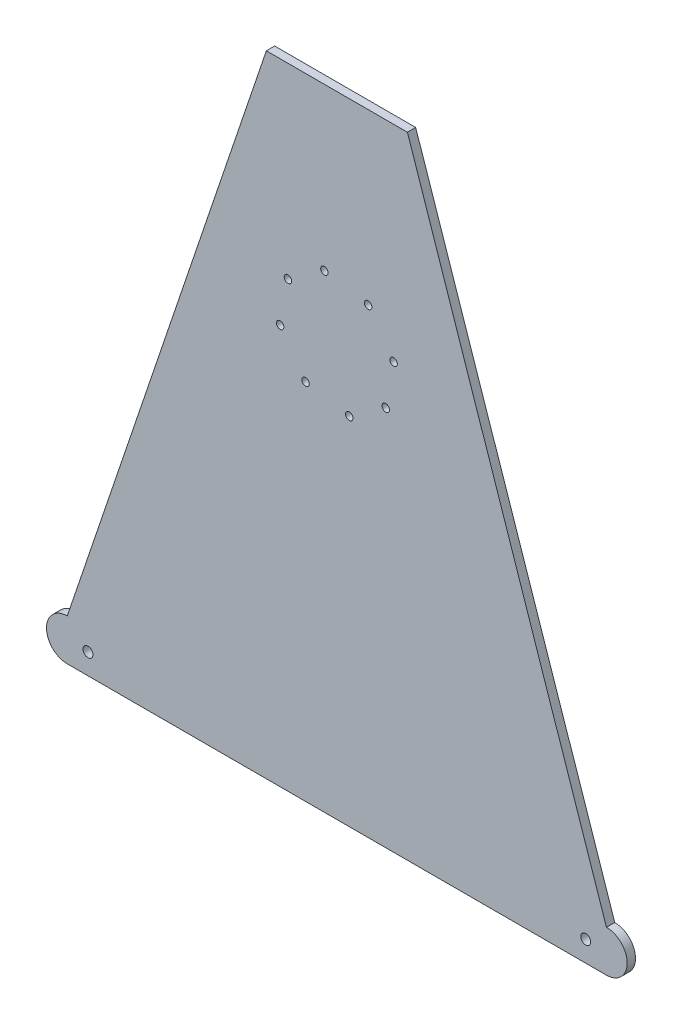
ISO-10303-21;
HEADER;
FILE_DESCRIPTION(('STEP AP214'),'2;1');
FILE_NAME('part.step','',(''),(''),'','','');
FILE_SCHEMA(('AUTOMOTIVE_DESIGN { 1 0 10303 214 1 1 1 1 }'));
ENDSEC;
DATA;
#1=APPLICATION_CONTEXT('core data for automotive mechanical design processes');
#2=APPLICATION_PROTOCOL_DEFINITION('international standard','automotive_design',2000,#1);
#3=PRODUCT_CONTEXT('',#1,'mechanical');
#4=PRODUCT('Part','Part','',(#3));
#5=PRODUCT_RELATED_PRODUCT_CATEGORY('part','',(#4));
#6=PRODUCT_DEFINITION_FORMATION('','',#4);
#7=PRODUCT_DEFINITION_CONTEXT('part definition',#1,'design');
#8=PRODUCT_DEFINITION('design','',#6,#7);
#9=PRODUCT_DEFINITION_SHAPE('','',#8);
#10=(LENGTH_UNIT() NAMED_UNIT(*) SI_UNIT(.MILLI.,.METRE.));
#11=(NAMED_UNIT(*) PLANE_ANGLE_UNIT() SI_UNIT($,.RADIAN.));
#12=(NAMED_UNIT(*) SI_UNIT($,.STERADIAN.) SOLID_ANGLE_UNIT());
#13=UNCERTAINTY_MEASURE_WITH_UNIT(LENGTH_MEASURE(1.E-05),#10,'distance_accuracy_value','');
#14=(GEOMETRIC_REPRESENTATION_CONTEXT(3) GLOBAL_UNCERTAINTY_ASSIGNED_CONTEXT((#13)) GLOBAL_UNIT_ASSIGNED_CONTEXT((#10,
#11,#12)) REPRESENTATION_CONTEXT('',''));
#15=CARTESIAN_POINT('',(0.,0.,0.));
#16=DIRECTION('',(0.,0.,1.));
#17=DIRECTION('',(1.,0.,0.));
#18=AXIS2_PLACEMENT_3D('',#15,#16,#17);
#19=CARTESIAN_POINT('',(325.,0.,-10.));
#20=DIRECTION('',(0.,0.,1.));
#21=DIRECTION('',(-1.,0.,0.));
#22=AXIS2_PLACEMENT_3D('',#19,#20,#21);
#23=CYLINDRICAL_SURFACE('',#22,25.);
#24=DIRECTION('',(0.,0.,1.));
#25=VECTOR('',#24,1.);
#26=CARTESIAN_POINT('',(325.,25.,-10.));
#27=LINE('',#26,#25);
#28=CARTESIAN_POINT('',(325.,25.,-10.));
#29=VERTEX_POINT('',#28);
#30=CARTESIAN_POINT('',(325.,25.,0.));
#31=VERTEX_POINT('',#30);
#32=EDGE_CURVE('E146',#29,#31,#27,.T.);
#33=ORIENTED_EDGE('',*,*,#32,.T.);
#34=CARTESIAN_POINT('',(325.,0.,0.));
#35=DIRECTION('',(0.,0.,-1.));
#36=DIRECTION('',(-1.,0.,0.));
#37=AXIS2_PLACEMENT_3D('',#34,#35,#36);
#38=CIRCLE('',#37,25.);
#39=CARTESIAN_POINT('',(325.,-25.,0.));
#40=VERTEX_POINT('',#39);
#41=EDGE_CURVE('E44',#31,#40,#38,.T.);
#42=ORIENTED_EDGE('',*,*,#41,.T.);
#43=DIRECTION('',(0.,0.,1.));
#44=VECTOR('',#43,1.);
#45=CARTESIAN_POINT('',(325.,-25.,-10.));
#46=LINE('',#45,#44);
#47=CARTESIAN_POINT('',(325.,-25.,-10.));
#48=VERTEX_POINT('',#47);
#49=EDGE_CURVE('E148',#40,#48,#46,.F.);
#50=ORIENTED_EDGE('',*,*,#49,.T.);
#51=CARTESIAN_POINT('',(325.,0.,-10.));
#52=DIRECTION('',(0.,0.,-1.));
#53=DIRECTION('',(-1.,0.,0.));
#54=AXIS2_PLACEMENT_3D('',#51,#52,#53);
#55=CIRCLE('',#54,25.);
#56=EDGE_CURVE('E151',#48,#29,#55,.F.);
#57=ORIENTED_EDGE('',*,*,#56,.T.);
#58=EDGE_LOOP('',(#33,#42,#50,#57));
#59=FACE_BOUND('',#58,.T.);
#60=ADVANCED_FACE('F37',(#59),#23,.T.);
#61=CARTESIAN_POINT('',(-325.,0.,0.));
#62=DIRECTION('',(0.,0.,1.));
#63=DIRECTION('',(-1.,0.,0.));
#64=AXIS2_PLACEMENT_3D('',#61,#62,#63);
#65=CYLINDRICAL_SURFACE('',#64,25.);
#66=DIRECTION('',(0.,0.,1.));
#67=VECTOR('',#66,1.);
#68=CARTESIAN_POINT('',(-325.,25.,-10.));
#69=LINE('',#68,#67);
#70=CARTESIAN_POINT('',(-325.,25.,0.));
#71=VERTEX_POINT('',#70);
#72=CARTESIAN_POINT('',(-325.,25.,-10.));
#73=VERTEX_POINT('',#72);
#74=EDGE_CURVE('E133',#71,#73,#69,.F.);
#75=ORIENTED_EDGE('',*,*,#74,.T.);
#76=CARTESIAN_POINT('',(-325.,0.,-10.));
#77=DIRECTION('',(0.,0.,-1.));
#78=DIRECTION('',(-1.,0.,0.));
#79=AXIS2_PLACEMENT_3D('',#76,#77,#78);
#80=CIRCLE('',#79,25.);
#81=CARTESIAN_POINT('',(-325.,-25.,-10.));
#82=VERTEX_POINT('',#81);
#83=EDGE_CURVE('E143',#73,#82,#80,.F.);
#84=ORIENTED_EDGE('',*,*,#83,.T.);
#85=DIRECTION('',(0.,0.,1.));
#86=VECTOR('',#85,1.);
#87=CARTESIAN_POINT('',(-325.,-25.,-10.));
#88=LINE('',#87,#86);
#89=CARTESIAN_POINT('',(-325.,-25.,0.));
#90=VERTEX_POINT('',#89);
#91=EDGE_CURVE('E137',#82,#90,#88,.T.);
#92=ORIENTED_EDGE('',*,*,#91,.T.);
#93=CARTESIAN_POINT('',(-325.,0.,0.));
#94=DIRECTION('',(0.,0.,-1.));
#95=DIRECTION('',(-1.,0.,0.));
#96=AXIS2_PLACEMENT_3D('',#93,#94,#95);
#97=CIRCLE('',#96,25.);
#98=EDGE_CURVE('E140',#90,#71,#97,.T.);
#99=ORIENTED_EDGE('',*,*,#98,.T.);
#100=EDGE_LOOP('',(#75,#84,#92,#99));
#101=FACE_BOUND('',#100,.T.);
#102=ADVANCED_FACE('F258',(#101),#65,.T.);
#103=CARTESIAN_POINT('',(0.,0.,-10.));
#104=DIRECTION('',(0.,0.,1.));
#105=DIRECTION('',(-1.,0.,0.));
#106=AXIS2_PLACEMENT_3D('',#103,#104,#105);
#107=PLANE('',#106);
#108=CARTESIAN_POINT('',(0.,472.,-10.));
#109=DIRECTION('',(0.,0.,-1.));
#110=DIRECTION('',(-1.,0.,0.));
#111=AXIS2_PLACEMENT_3D('',#108,#109,#110);
#112=CIRCLE('',#111,100.);
#113=CARTESIAN_POINT('',(-100.,472.,-10.));
#114=VERTEX_POINT('',#113);
#115=EDGE_CURVE('E11',#114,#114,#112,.F.);
#116=ORIENTED_EDGE('',*,*,#115,.T.);
#117=EDGE_LOOP('',(#116));
#118=FACE_BOUND('',#117,.T.);
#119=DIRECTION('',(1.,0.,0.));
#120=VECTOR('',#119,1.);
#121=CARTESIAN_POINT('',(-350.,-25.,-10.));
#122=LINE('',#121,#120);
#123=EDGE_CURVE('E58',#82,#48,#122,.T.);
#124=ORIENTED_EDGE('',*,*,#123,.F.);
#125=ORIENTED_EDGE('',*,*,#83,.F.);
#126=DIRECTION('',(-0.320227798569515,-0.947340570768149,0.));
#127=VECTOR('',#126,1.);
#128=CARTESIAN_POINT('',(-325.,25.,-10.));
#129=LINE('',#128,#127);
#130=CARTESIAN_POINT('',(-85.,735.,-10.));
#131=VERTEX_POINT('',#130);
#132=EDGE_CURVE('E110',#131,#73,#129,.T.);
#133=ORIENTED_EDGE('',*,*,#132,.F.);
#134=DIRECTION('',(-1.,0.,0.));
#135=VECTOR('',#134,1.);
#136=CARTESIAN_POINT('',(-85.,735.,-10.));
#137=LINE('',#136,#135);
#138=CARTESIAN_POINT('',(85.,735.,-10.));
#139=VERTEX_POINT('',#138);
#140=EDGE_CURVE('E112',#139,#131,#137,.T.);
#141=ORIENTED_EDGE('',*,*,#140,.F.);
#142=DIRECTION('',(-0.320227798569515,0.947340570768149,0.));
#143=VECTOR('',#142,1.);
#144=CARTESIAN_POINT('',(85.,735.,-10.));
#145=LINE('',#144,#143);
#146=EDGE_CURVE('E95',#29,#139,#145,.T.);
#147=ORIENTED_EDGE('',*,*,#146,.F.);
#148=ORIENTED_EDGE('',*,*,#56,.F.);
#149=EDGE_LOOP('',(#124,#125,#133,#141,#147,#148));
#150=FACE_BOUND('',#149,.T.);
#151=CARTESIAN_POINT('',(-300.,0.,-10.));
#152=DIRECTION('',(0.,0.,1.));
#153=DIRECTION('',(1.,0.,0.));
#154=AXIS2_PLACEMENT_3D('',#151,#152,#153);
#155=CIRCLE('',#154,5.99999999999999);
#156=CARTESIAN_POINT('',(-294.,0.,-10.));
#157=VERTEX_POINT('',#156);
#158=EDGE_CURVE('E127',#157,#157,#155,.T.);
#159=ORIENTED_EDGE('',*,*,#158,.T.);
#160=EDGE_LOOP('',(#159));
#161=FACE_BOUND('',#160,.T.);
#162=CARTESIAN_POINT('',(300.,0.,-10.));
#163=DIRECTION('',(0.,0.,1.));
#164=DIRECTION('',(1.,0.,0.));
#165=AXIS2_PLACEMENT_3D('',#162,#163,#164);
#166=CIRCLE('',#165,5.99999999999999);
#167=CARTESIAN_POINT('',(306.,0.,-10.));
#168=VERTEX_POINT('',#167);
#169=EDGE_CURVE('E121',#168,#168,#166,.T.);
#170=ORIENTED_EDGE('',*,*,#169,.T.);
#171=EDGE_LOOP('',(#170));
#172=FACE_BOUND('',#171,.T.);
#173=ADVANCED_FACE('F155',(#118,#150,#161,#172),#107,.F.);
#174=CARTESIAN_POINT('',(0.,0.,0.));
#175=DIRECTION('',(0.,0.,1.));
#176=DIRECTION('',(-1.,0.,0.));
#177=AXIS2_PLACEMENT_3D('',#174,#175,#176);
#178=PLANE('',#177);
#179=CARTESIAN_POINT('',(15.0022039899516,403.626511896468,0.));
#180=DIRECTION('',(0.,0.,1.));
#181=DIRECTION('',(0.707106781186546,0.707106781186549,0.));
#182=AXIS2_PLACEMENT_3D('',#179,#180,#181);
#183=CIRCLE('',#182,4.5);
#184=CARTESIAN_POINT('',(18.184184505291,406.808492411807,0.));
#185=VERTEX_POINT('',#184);
#186=EDGE_CURVE('E175',#185,#185,#183,.T.);
#187=ORIENTED_EDGE('',*,*,#186,.F.);
#188=EDGE_LOOP('',(#187));
#189=FACE_BOUND('',#188,.T.);
#190=CARTESIAN_POINT('',(58.9555172654241,434.260803082653,0.));
#191=DIRECTION('',(0.,0.,1.));
#192=DIRECTION('',(0.,1.,0.));
#193=AXIS2_PLACEMENT_3D('',#190,#191,#192);
#194=CIRCLE('',#193,4.5);
#195=CARTESIAN_POINT('',(58.9555172654241,438.760803082653,0.));
#196=VERTEX_POINT('',#195);
#197=EDGE_CURVE('E211',#196,#196,#194,.T.);
#198=ORIENTED_EDGE('',*,*,#197,.F.);
#199=EDGE_LOOP('',(#198));
#200=FACE_BOUND('',#199,.T.);
#201=CARTESIAN_POINT('',(68.3734881035323,487.002203989952,0.));
#202=DIRECTION('',(0.,0.,1.));
#203=DIRECTION('',(-0.707106781186551,0.707106781186544,0.));
#204=AXIS2_PLACEMENT_3D('',#201,#202,#203);
#205=CIRCLE('',#204,4.5);
#206=CARTESIAN_POINT('',(65.1915075881928,490.184184505291,0.));
#207=VERTEX_POINT('',#206);
#208=EDGE_CURVE('E205',#207,#207,#205,.T.);
#209=ORIENTED_EDGE('',*,*,#208,.F.);
#210=EDGE_LOOP('',(#209));
#211=FACE_BOUND('',#210,.T.);
#212=CARTESIAN_POINT('',(37.739196917347,530.955517265424,0.));
#213=DIRECTION('',(0.,0.,1.));
#214=DIRECTION('',(-1.,0.,0.));
#215=AXIS2_PLACEMENT_3D('',#212,#213,#214);
#216=CIRCLE('',#215,4.5);
#217=CARTESIAN_POINT('',(33.239196917347,530.955517265424,0.));
#218=VERTEX_POINT('',#217);
#219=EDGE_CURVE('E199',#218,#218,#216,.T.);
#220=ORIENTED_EDGE('',*,*,#219,.F.);
#221=EDGE_LOOP('',(#220));
#222=FACE_BOUND('',#221,.T.);
#223=CARTESIAN_POINT('',(-15.002203989952,540.373488103532,0.));
#224=DIRECTION('',(0.,0.,1.));
#225=DIRECTION('',(-0.707106781186541,-0.707106781186554,0.));
#226=AXIS2_PLACEMENT_3D('',#223,#224,#225);
#227=CIRCLE('',#226,4.5);
#228=CARTESIAN_POINT('',(-18.1841845052914,537.191507588193,0.));
#229=VERTEX_POINT('',#228);
#230=EDGE_CURVE('E193',#229,#229,#227,.T.);
#231=ORIENTED_EDGE('',*,*,#230,.F.);
#232=EDGE_LOOP('',(#231));
#233=FACE_BOUND('',#232,.T.);
#234=CARTESIAN_POINT('',(-58.9555172654244,509.739196917346,0.));
#235=DIRECTION('',(0.,0.,1.));
#236=DIRECTION('',(0.,-1.,0.));
#237=AXIS2_PLACEMENT_3D('',#234,#235,#236);
#238=CIRCLE('',#237,4.5);
#239=CARTESIAN_POINT('',(-58.9555172654244,505.239196917346,0.));
#240=VERTEX_POINT('',#239);
#241=EDGE_CURVE('E187',#240,#240,#238,.T.);
#242=ORIENTED_EDGE('',*,*,#241,.F.);
#243=EDGE_LOOP('',(#242));
#244=FACE_BOUND('',#243,.T.);
#245=CARTESIAN_POINT('',(-68.3734881035322,456.997796010048,0.));
#246=DIRECTION('',(0.,0.,1.));
#247=DIRECTION('',(0.707106781186556,-0.707106781186539,0.));
#248=AXIS2_PLACEMENT_3D('',#245,#246,#247);
#249=CIRCLE('',#248,4.5);
#250=CARTESIAN_POINT('',(-65.1915075881927,453.815815494708,0.));
#251=VERTEX_POINT('',#250);
#252=EDGE_CURVE('E181',#251,#251,#249,.T.);
#253=ORIENTED_EDGE('',*,*,#252,.F.);
#254=EDGE_LOOP('',(#253));
#255=FACE_BOUND('',#254,.T.);
#256=CARTESIAN_POINT('',(-37.739196917347,413.044482734576,0.));
#257=DIRECTION('',(0.,0.,1.));
#258=DIRECTION('',(1.,0.,0.));
#259=AXIS2_PLACEMENT_3D('',#256,#257,#258);
#260=CIRCLE('',#259,4.5);
#261=CARTESIAN_POINT('',(-33.239196917347,413.044482734576,0.));
#262=VERTEX_POINT('',#261);
#263=EDGE_CURVE('E170',#262,#262,#260,.T.);
#264=ORIENTED_EDGE('',*,*,#263,.F.);
#265=EDGE_LOOP('',(#264));
#266=FACE_BOUND('',#265,.T.);
#267=CARTESIAN_POINT('',(-300.,0.,0.));
#268=DIRECTION('',(0.,0.,1.));
#269=DIRECTION('',(1.,0.,0.));
#270=AXIS2_PLACEMENT_3D('',#267,#268,#269);
#271=CIRCLE('',#270,5.99999999999999);
#272=CARTESIAN_POINT('',(-294.,0.,0.));
#273=VERTEX_POINT('',#272);
#274=EDGE_CURVE('E124',#273,#273,#271,.T.);
#275=ORIENTED_EDGE('',*,*,#274,.F.);
#276=EDGE_LOOP('',(#275));
#277=FACE_BOUND('',#276,.T.);
#278=ORIENTED_EDGE('',*,*,#98,.F.);
#279=DIRECTION('',(1.,0.,0.));
#280=VECTOR('',#279,1.);
#281=CARTESIAN_POINT('',(-350.,-25.,0.));
#282=LINE('',#281,#280);
#283=EDGE_CURVE('E51',#90,#40,#282,.T.);
#284=ORIENTED_EDGE('',*,*,#283,.T.);
#285=ORIENTED_EDGE('',*,*,#41,.F.);
#286=DIRECTION('',(-0.320227798569515,0.947340570768149,0.));
#287=VECTOR('',#286,1.);
#288=CARTESIAN_POINT('',(85.,735.,0.));
#289=LINE('',#288,#287);
#290=CARTESIAN_POINT('',(85.,735.,0.));
#291=VERTEX_POINT('',#290);
#292=EDGE_CURVE('E94',#31,#291,#289,.T.);
#293=ORIENTED_EDGE('',*,*,#292,.T.);
#294=DIRECTION('',(-1.,0.,0.));
#295=VECTOR('',#294,1.);
#296=CARTESIAN_POINT('',(-85.,735.,0.));
#297=LINE('',#296,#295);
#298=CARTESIAN_POINT('',(-85.,735.,0.));
#299=VERTEX_POINT('',#298);
#300=EDGE_CURVE('E99',#291,#299,#297,.T.);
#301=ORIENTED_EDGE('',*,*,#300,.T.);
#302=DIRECTION('',(-0.320227798569515,-0.947340570768149,0.));
#303=VECTOR('',#302,1.);
#304=CARTESIAN_POINT('',(-325.,25.,0.));
#305=LINE('',#304,#303);
#306=EDGE_CURVE('E117',#299,#71,#305,.T.);
#307=ORIENTED_EDGE('',*,*,#306,.T.);
#308=EDGE_LOOP('',(#278,#284,#285,#293,#301,#307));
#309=FACE_BOUND('',#308,.T.);
#310=CARTESIAN_POINT('',(300.,0.,0.));
#311=DIRECTION('',(0.,0.,1.));
#312=DIRECTION('',(1.,0.,0.));
#313=AXIS2_PLACEMENT_3D('',#310,#311,#312);
#314=CIRCLE('',#313,5.99999999999999);
#315=CARTESIAN_POINT('',(306.,0.,0.));
#316=VERTEX_POINT('',#315);
#317=EDGE_CURVE('E118',#316,#316,#314,.T.);
#318=ORIENTED_EDGE('',*,*,#317,.F.);
#319=EDGE_LOOP('',(#318));
#320=FACE_BOUND('',#319,.T.);
#321=ADVANCED_FACE('F106',(#189,#200,#211,#222,#233,#244,#255,#266,#277,#309,#320),#178,.T.);
#322=CARTESIAN_POINT('',(-350.,-25.,-10.));
#323=DIRECTION('',(0.,1.,0.));
#324=DIRECTION('',(0.,0.,-1.));
#325=AXIS2_PLACEMENT_3D('',#322,#323,#324);
#326=PLANE('',#325);
#327=ORIENTED_EDGE('',*,*,#283,.F.);
#328=ORIENTED_EDGE('',*,*,#91,.F.);
#329=ORIENTED_EDGE('',*,*,#123,.T.);
#330=ORIENTED_EDGE('',*,*,#49,.F.);
#331=EDGE_LOOP('',(#327,#328,#329,#330));
#332=FACE_BOUND('',#331,.T.);
#333=ADVANCED_FACE('F225',(#332),#326,.F.);
#334=CARTESIAN_POINT('',(-300.,0.,-10.));
#335=DIRECTION('',(0.,0.,1.));
#336=DIRECTION('',(-1.,0.,0.));
#337=AXIS2_PLACEMENT_3D('',#334,#335,#336);
#338=CYLINDRICAL_SURFACE('',#337,5.99999999999999);
#339=ORIENTED_EDGE('',*,*,#158,.F.);
#340=EDGE_LOOP('',(#339));
#341=FACE_BOUND('',#340,.T.);
#342=ORIENTED_EDGE('',*,*,#274,.T.);
#343=EDGE_LOOP('',(#342));
#344=FACE_BOUND('',#343,.T.);
#345=ADVANCED_FACE('F243',(#341,#344),#338,.F.);
#346=CARTESIAN_POINT('',(300.,0.,-10.));
#347=DIRECTION('',(0.,0.,1.));
#348=DIRECTION('',(-1.,0.,0.));
#349=AXIS2_PLACEMENT_3D('',#346,#347,#348);
#350=CYLINDRICAL_SURFACE('',#349,5.99999999999999);
#351=ORIENTED_EDGE('',*,*,#169,.F.);
#352=EDGE_LOOP('',(#351));
#353=FACE_BOUND('',#352,.T.);
#354=ORIENTED_EDGE('',*,*,#317,.T.);
#355=EDGE_LOOP('',(#354));
#356=FACE_BOUND('',#355,.T.);
#357=ADVANCED_FACE('F245',(#353,#356),#350,.F.);
#358=CARTESIAN_POINT('',(85.,735.,962.60064408871));
#359=DIRECTION('',(0.947340570768149,0.320227798569515,0.));
#360=DIRECTION('',(-0.320227798569515,0.947340570768149,0.));
#361=AXIS2_PLACEMENT_3D('',#358,#359,#360);
#362=PLANE('',#361);
#363=ORIENTED_EDGE('',*,*,#32,.F.);
#364=ORIENTED_EDGE('',*,*,#146,.T.);
#365=DIRECTION('',(0.,0.,-1.));
#366=VECTOR('',#365,1.);
#367=CARTESIAN_POINT('',(85.,735.,962.60064408871));
#368=LINE('',#367,#366);
#369=EDGE_CURVE('E89',#291,#139,#368,.T.);
#370=ORIENTED_EDGE('',*,*,#369,.F.);
#371=ORIENTED_EDGE('',*,*,#292,.F.);
#372=EDGE_LOOP('',(#363,#364,#370,#371));
#373=FACE_BOUND('',#372,.T.);
#374=ADVANCED_FACE('F92',(#373),#362,.T.);
#375=CARTESIAN_POINT('',(-85.,735.,962.60064408871));
#376=DIRECTION('',(0.,1.,0.));
#377=DIRECTION('',(0.,0.,-1.));
#378=AXIS2_PLACEMENT_3D('',#375,#376,#377);
#379=PLANE('',#378);
#380=ORIENTED_EDGE('',*,*,#369,.T.);
#381=ORIENTED_EDGE('',*,*,#140,.T.);
#382=DIRECTION('',(0.,0.,-1.));
#383=VECTOR('',#382,1.);
#384=CARTESIAN_POINT('',(-85.,735.,962.60064408871));
#385=LINE('',#384,#383);
#386=EDGE_CURVE('E103',#299,#131,#385,.T.);
#387=ORIENTED_EDGE('',*,*,#386,.F.);
#388=ORIENTED_EDGE('',*,*,#300,.F.);
#389=EDGE_LOOP('',(#380,#381,#387,#388));
#390=FACE_BOUND('',#389,.T.);
#391=ADVANCED_FACE('F102',(#390),#379,.T.);
#392=CARTESIAN_POINT('',(-325.,25.,962.60064408871));
#393=DIRECTION('',(-0.947340570768149,0.320227798569515,0.));
#394=DIRECTION('',(-0.320227798569515,-0.947340570768149,0.));
#395=AXIS2_PLACEMENT_3D('',#392,#393,#394);
#396=PLANE('',#395);
#397=ORIENTED_EDGE('',*,*,#386,.T.);
#398=ORIENTED_EDGE('',*,*,#132,.T.);
#399=ORIENTED_EDGE('',*,*,#74,.F.);
#400=ORIENTED_EDGE('',*,*,#306,.F.);
#401=EDGE_LOOP('',(#397,#398,#399,#400));
#402=FACE_BOUND('',#401,.T.);
#403=ADVANCED_FACE('F270',(#402),#396,.T.);
#404=CARTESIAN_POINT('',(0.,472.,-40.));
#405=DIRECTION('',(0.,0.,-1.));
#406=DIRECTION('',(1.,0.,0.));
#407=AXIS2_PLACEMENT_3D('',#404,#405,#406);
#408=PLANE('',#407);
#409=CARTESIAN_POINT('',(0.,472.,-40.));
#410=DIRECTION('',(0.,0.,1.));
#411=DIRECTION('',(1.,0.,0.));
#412=AXIS2_PLACEMENT_3D('',#409,#410,#411);
#413=CIRCLE('',#412,100.);
#414=CARTESIAN_POINT('',(100.,472.,-40.));
#415=VERTEX_POINT('',#414);
#416=EDGE_CURVE('E159',#415,#415,#413,.T.);
#417=ORIENTED_EDGE('',*,*,#416,.F.);
#418=EDGE_LOOP('',(#417));
#419=FACE_BOUND('',#418,.T.);
#420=CARTESIAN_POINT('',(0.,472.,-40.));
#421=DIRECTION('',(0.,0.,1.));
#422=DIRECTION('',(1.,0.,0.));
#423=AXIS2_PLACEMENT_3D('',#420,#421,#422);
#424=CIRCLE('',#423,82.5);
#425=CARTESIAN_POINT('',(82.5,472.,-40.));
#426=VERTEX_POINT('',#425);
#427=EDGE_CURVE('E161',#426,#426,#424,.T.);
#428=ORIENTED_EDGE('',*,*,#427,.T.);
#429=EDGE_LOOP('',(#428));
#430=FACE_BOUND('',#429,.T.);
#431=ADVANCED_FACE('F272',(#419,#430),#408,.T.);
#432=CARTESIAN_POINT('',(0.,472.,-40.));
#433=DIRECTION('',(0.,0.,1.));
#434=DIRECTION('',(-1.,0.,0.));
#435=AXIS2_PLACEMENT_3D('',#432,#433,#434);
#436=CYLINDRICAL_SURFACE('',#435,100.);
#437=ORIENTED_EDGE('',*,*,#416,.T.);
#438=EDGE_LOOP('',(#437));
#439=FACE_BOUND('',#438,.T.);
#440=ORIENTED_EDGE('',*,*,#115,.F.);
#441=EDGE_LOOP('',(#440));
#442=FACE_BOUND('',#441,.T.);
#443=ADVANCED_FACE('F278',(#439,#442),#436,.T.);
#444=CARTESIAN_POINT('',(0.,472.,-40.));
#445=DIRECTION('',(0.,0.,1.));
#446=DIRECTION('',(-1.,0.,0.));
#447=AXIS2_PLACEMENT_3D('',#444,#445,#446);
#448=CYLINDRICAL_SURFACE('',#447,82.5);
#449=ORIENTED_EDGE('',*,*,#427,.F.);
#450=EDGE_LOOP('',(#449));
#451=FACE_BOUND('',#450,.T.);
#452=CARTESIAN_POINT('',(0.,472.,-10.));
#453=DIRECTION('',(0.,0.,1.));
#454=DIRECTION('',(1.,0.,0.));
#455=AXIS2_PLACEMENT_3D('',#452,#453,#454);
#456=CIRCLE('',#455,82.5);
#457=CARTESIAN_POINT('',(82.5,472.,-10.));
#458=VERTEX_POINT('',#457);
#459=EDGE_CURVE('E166',#458,#458,#456,.T.);
#460=ORIENTED_EDGE('',*,*,#459,.T.);
#461=EDGE_LOOP('',(#460));
#462=FACE_BOUND('',#461,.T.);
#463=ADVANCED_FACE('F312',(#451,#462),#448,.F.);
#464=CARTESIAN_POINT('',(15.0022039899516,403.626511896468,-10.));
#465=DIRECTION('',(0.,0.,1.));
#466=DIRECTION('',(0.707106781186546,0.707106781186549,0.));
#467=AXIS2_PLACEMENT_3D('',#464,#465,#466);
#468=CIRCLE('',#467,4.5);
#469=CARTESIAN_POINT('',(18.184184505291,406.808492411807,-10.));
#470=VERTEX_POINT('',#469);
#471=EDGE_CURVE('E214',#470,#470,#468,.T.);
#472=ORIENTED_EDGE('',*,*,#471,.T.);
#473=EDGE_LOOP('',(#472));
#474=FACE_BOUND('',#473,.T.);
#475=CARTESIAN_POINT('',(58.9555172654241,434.260803082653,-10.));
#476=DIRECTION('',(0.,0.,1.));
#477=DIRECTION('',(0.,1.,0.));
#478=AXIS2_PLACEMENT_3D('',#475,#476,#477);
#479=CIRCLE('',#478,4.5);
#480=CARTESIAN_POINT('',(58.9555172654241,438.760803082653,-10.));
#481=VERTEX_POINT('',#480);
#482=EDGE_CURVE('E208',#481,#481,#479,.T.);
#483=ORIENTED_EDGE('',*,*,#482,.T.);
#484=EDGE_LOOP('',(#483));
#485=FACE_BOUND('',#484,.T.);
#486=CARTESIAN_POINT('',(68.3734881035323,487.002203989952,-10.));
#487=DIRECTION('',(0.,0.,1.));
#488=DIRECTION('',(-0.707106781186551,0.707106781186544,0.));
#489=AXIS2_PLACEMENT_3D('',#486,#487,#488);
#490=CIRCLE('',#489,4.5);
#491=CARTESIAN_POINT('',(65.1915075881928,490.184184505291,-10.));
#492=VERTEX_POINT('',#491);
#493=EDGE_CURVE('E202',#492,#492,#490,.T.);
#494=ORIENTED_EDGE('',*,*,#493,.T.);
#495=EDGE_LOOP('',(#494));
#496=FACE_BOUND('',#495,.T.);
#497=CARTESIAN_POINT('',(37.739196917347,530.955517265424,-10.));
#498=DIRECTION('',(0.,0.,1.));
#499=DIRECTION('',(-1.,0.,0.));
#500=AXIS2_PLACEMENT_3D('',#497,#498,#499);
#501=CIRCLE('',#500,4.5);
#502=CARTESIAN_POINT('',(33.239196917347,530.955517265424,-10.));
#503=VERTEX_POINT('',#502);
#504=EDGE_CURVE('E196',#503,#503,#501,.T.);
#505=ORIENTED_EDGE('',*,*,#504,.T.);
#506=EDGE_LOOP('',(#505));
#507=FACE_BOUND('',#506,.T.);
#508=CARTESIAN_POINT('',(-15.002203989952,540.373488103532,-10.));
#509=DIRECTION('',(0.,0.,1.));
#510=DIRECTION('',(-0.707106781186541,-0.707106781186554,0.));
#511=AXIS2_PLACEMENT_3D('',#508,#509,#510);
#512=CIRCLE('',#511,4.5);
#513=CARTESIAN_POINT('',(-18.1841845052914,537.191507588193,-10.));
#514=VERTEX_POINT('',#513);
#515=EDGE_CURVE('E190',#514,#514,#512,.T.);
#516=ORIENTED_EDGE('',*,*,#515,.T.);
#517=EDGE_LOOP('',(#516));
#518=FACE_BOUND('',#517,.T.);
#519=CARTESIAN_POINT('',(-58.9555172654244,509.739196917346,-10.));
#520=DIRECTION('',(0.,0.,1.));
#521=DIRECTION('',(0.,-1.,0.));
#522=AXIS2_PLACEMENT_3D('',#519,#520,#521);
#523=CIRCLE('',#522,4.5);
#524=CARTESIAN_POINT('',(-58.9555172654244,505.239196917346,-10.));
#525=VERTEX_POINT('',#524);
#526=EDGE_CURVE('E184',#525,#525,#523,.T.);
#527=ORIENTED_EDGE('',*,*,#526,.T.);
#528=EDGE_LOOP('',(#527));
#529=FACE_BOUND('',#528,.T.);
#530=CARTESIAN_POINT('',(-68.3734881035322,456.997796010048,-10.));
#531=DIRECTION('',(0.,0.,1.));
#532=DIRECTION('',(0.707106781186556,-0.707106781186539,0.));
#533=AXIS2_PLACEMENT_3D('',#530,#531,#532);
#534=CIRCLE('',#533,4.5);
#535=CARTESIAN_POINT('',(-65.1915075881927,453.815815494708,-10.));
#536=VERTEX_POINT('',#535);
#537=EDGE_CURVE('E178',#536,#536,#534,.T.);
#538=ORIENTED_EDGE('',*,*,#537,.T.);
#539=EDGE_LOOP('',(#538));
#540=FACE_BOUND('',#539,.T.);
#541=CARTESIAN_POINT('',(-37.739196917347,413.044482734576,-10.));
#542=DIRECTION('',(0.,0.,1.));
#543=DIRECTION('',(1.,0.,0.));
#544=AXIS2_PLACEMENT_3D('',#541,#542,#543);
#545=CIRCLE('',#544,4.5);
#546=CARTESIAN_POINT('',(-33.239196917347,413.044482734576,-10.));
#547=VERTEX_POINT('',#546);
#548=EDGE_CURVE('E172',#547,#547,#545,.T.);
#549=ORIENTED_EDGE('',*,*,#548,.T.);
#550=EDGE_LOOP('',(#549));
#551=FACE_BOUND('',#550,.T.);
#552=ORIENTED_EDGE('',*,*,#459,.F.);
#553=EDGE_LOOP('',(#552));
#554=FACE_BOUND('',#553,.T.);
#555=ADVANCED_FACE('F267',(#474,#485,#496,#507,#518,#529,#540,#551,#554),#107,.F.);
#556=CARTESIAN_POINT('',(-37.739196917347,413.044482734576,0.));
#557=DIRECTION('',(0.,0.,-1.));
#558=DIRECTION('',(1.,0.,0.));
#559=AXIS2_PLACEMENT_3D('',#556,#557,#558);
#560=CYLINDRICAL_SURFACE('',#559,4.5);
#561=ORIENTED_EDGE('',*,*,#263,.T.);
#562=EDGE_LOOP('',(#561));
#563=FACE_BOUND('',#562,.T.);
#564=ORIENTED_EDGE('',*,*,#548,.F.);
#565=EDGE_LOOP('',(#564));
#566=FACE_BOUND('',#565,.T.);
#567=ADVANCED_FACE('F330',(#563,#566),#560,.F.);
#568=CARTESIAN_POINT('',(-68.3734881035322,456.997796010048,0.));
#569=DIRECTION('',(0.,0.,-1.));
#570=DIRECTION('',(1.,0.,0.));
#571=AXIS2_PLACEMENT_3D('',#568,#569,#570);
#572=CYLINDRICAL_SURFACE('',#571,4.5);
#573=ORIENTED_EDGE('',*,*,#252,.T.);
#574=EDGE_LOOP('',(#573));
#575=FACE_BOUND('',#574,.T.);
#576=ORIENTED_EDGE('',*,*,#537,.F.);
#577=EDGE_LOOP('',(#576));
#578=FACE_BOUND('',#577,.T.);
#579=ADVANCED_FACE('F339',(#575,#578),#572,.F.);
#580=CARTESIAN_POINT('',(-58.9555172654244,509.739196917346,0.));
#581=DIRECTION('',(0.,0.,-1.));
#582=DIRECTION('',(1.,0.,0.));
#583=AXIS2_PLACEMENT_3D('',#580,#581,#582);
#584=CYLINDRICAL_SURFACE('',#583,4.5);
#585=ORIENTED_EDGE('',*,*,#241,.T.);
#586=EDGE_LOOP('',(#585));
#587=FACE_BOUND('',#586,.T.);
#588=ORIENTED_EDGE('',*,*,#526,.F.);
#589=EDGE_LOOP('',(#588));
#590=FACE_BOUND('',#589,.T.);
#591=ADVANCED_FACE('F349',(#587,#590),#584,.F.);
#592=CARTESIAN_POINT('',(-15.002203989952,540.373488103532,0.));
#593=DIRECTION('',(0.,0.,-1.));
#594=DIRECTION('',(1.,0.,0.));
#595=AXIS2_PLACEMENT_3D('',#592,#593,#594);
#596=CYLINDRICAL_SURFACE('',#595,4.5);
#597=ORIENTED_EDGE('',*,*,#230,.T.);
#598=EDGE_LOOP('',(#597));
#599=FACE_BOUND('',#598,.T.);
#600=ORIENTED_EDGE('',*,*,#515,.F.);
#601=EDGE_LOOP('',(#600));
#602=FACE_BOUND('',#601,.T.);
#603=ADVANCED_FACE('F359',(#599,#602),#596,.F.);
#604=CARTESIAN_POINT('',(37.739196917347,530.955517265424,0.));
#605=DIRECTION('',(0.,0.,-1.));
#606=DIRECTION('',(1.,0.,0.));
#607=AXIS2_PLACEMENT_3D('',#604,#605,#606);
#608=CYLINDRICAL_SURFACE('',#607,4.5);
#609=ORIENTED_EDGE('',*,*,#219,.T.);
#610=EDGE_LOOP('',(#609));
#611=FACE_BOUND('',#610,.T.);
#612=ORIENTED_EDGE('',*,*,#504,.F.);
#613=EDGE_LOOP('',(#612));
#614=FACE_BOUND('',#613,.T.);
#615=ADVANCED_FACE('F369',(#611,#614),#608,.F.);
#616=CARTESIAN_POINT('',(68.3734881035323,487.002203989952,0.));
#617=DIRECTION('',(0.,0.,-1.));
#618=DIRECTION('',(1.,0.,0.));
#619=AXIS2_PLACEMENT_3D('',#616,#617,#618);
#620=CYLINDRICAL_SURFACE('',#619,4.5);
#621=ORIENTED_EDGE('',*,*,#208,.T.);
#622=EDGE_LOOP('',(#621));
#623=FACE_BOUND('',#622,.T.);
#624=ORIENTED_EDGE('',*,*,#493,.F.);
#625=EDGE_LOOP('',(#624));
#626=FACE_BOUND('',#625,.T.);
#627=ADVANCED_FACE('F379',(#623,#626),#620,.F.);
#628=CARTESIAN_POINT('',(58.9555172654241,434.260803082653,0.));
#629=DIRECTION('',(0.,0.,-1.));
#630=DIRECTION('',(1.,0.,0.));
#631=AXIS2_PLACEMENT_3D('',#628,#629,#630);
#632=CYLINDRICAL_SURFACE('',#631,4.5);
#633=ORIENTED_EDGE('',*,*,#197,.T.);
#634=EDGE_LOOP('',(#633));
#635=FACE_BOUND('',#634,.T.);
#636=ORIENTED_EDGE('',*,*,#482,.F.);
#637=EDGE_LOOP('',(#636));
#638=FACE_BOUND('',#637,.T.);
#639=ADVANCED_FACE('F389',(#635,#638),#632,.F.);
#640=CARTESIAN_POINT('',(15.0022039899516,403.626511896468,0.));
#641=DIRECTION('',(0.,0.,-1.));
#642=DIRECTION('',(1.,0.,0.));
#643=AXIS2_PLACEMENT_3D('',#640,#641,#642);
#644=CYLINDRICAL_SURFACE('',#643,4.5);
#645=ORIENTED_EDGE('',*,*,#186,.T.);
#646=EDGE_LOOP('',(#645));
#647=FACE_BOUND('',#646,.T.);
#648=ORIENTED_EDGE('',*,*,#471,.F.);
#649=EDGE_LOOP('',(#648));
#650=FACE_BOUND('',#649,.T.);
#651=ADVANCED_FACE('F220',(#647,#650),#644,.F.);
#652=CLOSED_SHELL('',(#60,#102,#173,#321,#333,#345,#357,#374,#391,#403,#431,#443,#463,#555,#567,
#579,#591,#603,#615,#627,#639,#651));
#653=MANIFOLD_SOLID_BREP('B2',#652);
#654=ADVANCED_BREP_SHAPE_REPRESENTATION('',(#18,#653),#14);
#655=SHAPE_DEFINITION_REPRESENTATION(#9,#654);
ENDSEC;
END-ISO-10303-21;
